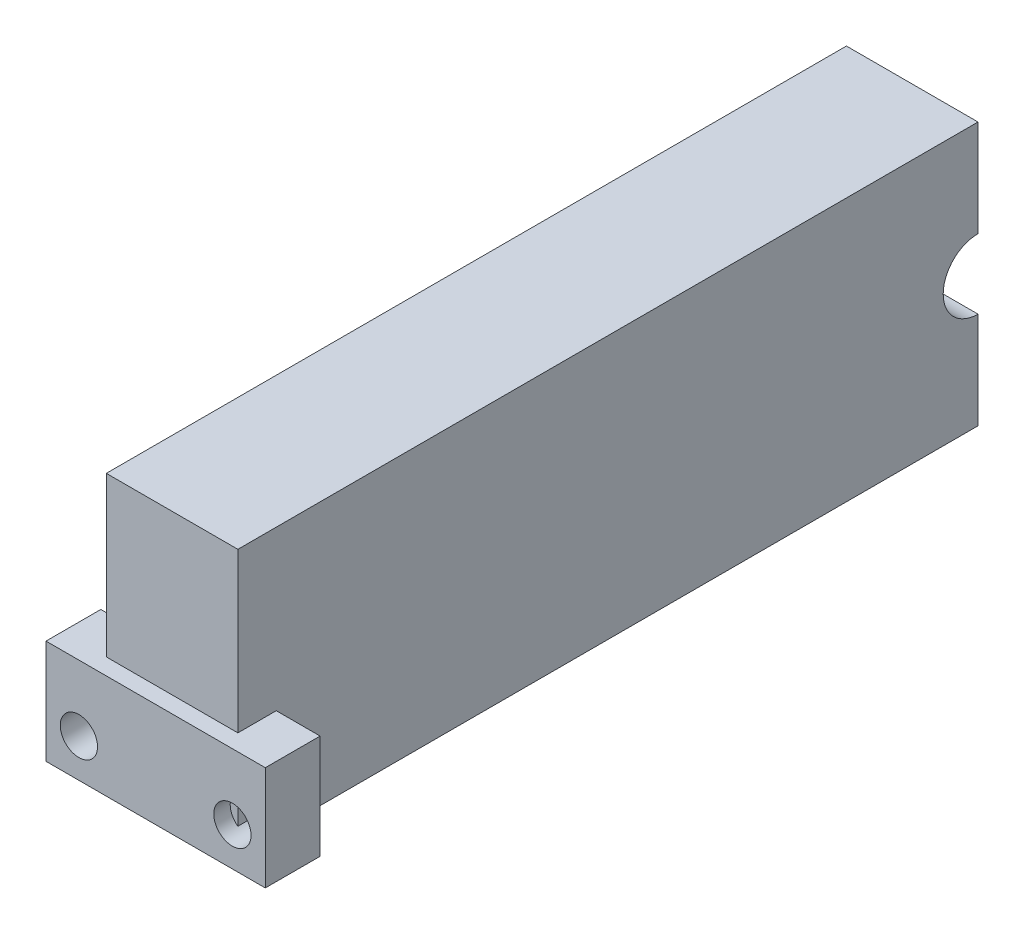
ISO-10303-21;
HEADER;
FILE_DESCRIPTION(('STEP AP214'),'2;1');
FILE_NAME('part.step','',(''),(''),'','','');
FILE_SCHEMA(('AUTOMOTIVE_DESIGN { 1 0 10303 214 1 1 1 1 }'));
ENDSEC;
DATA;
#1=APPLICATION_CONTEXT('core data for automotive mechanical design processes');
#2=APPLICATION_PROTOCOL_DEFINITION('international standard','automotive_design',2000,#1);
#3=PRODUCT_CONTEXT('',#1,'mechanical');
#4=PRODUCT('Part','Part','',(#3));
#5=PRODUCT_RELATED_PRODUCT_CATEGORY('part','',(#4));
#6=PRODUCT_DEFINITION_FORMATION('','',#4);
#7=PRODUCT_DEFINITION_CONTEXT('part definition',#1,'design');
#8=PRODUCT_DEFINITION('design','',#6,#7);
#9=PRODUCT_DEFINITION_SHAPE('','',#8);
#10=(LENGTH_UNIT() NAMED_UNIT(*) SI_UNIT(.MILLI.,.METRE.));
#11=(NAMED_UNIT(*) PLANE_ANGLE_UNIT() SI_UNIT($,.RADIAN.));
#12=(NAMED_UNIT(*) SI_UNIT($,.STERADIAN.) SOLID_ANGLE_UNIT());
#13=UNCERTAINTY_MEASURE_WITH_UNIT(LENGTH_MEASURE(1.E-05),#10,'distance_accuracy_value','');
#14=(GEOMETRIC_REPRESENTATION_CONTEXT(3) GLOBAL_UNCERTAINTY_ASSIGNED_CONTEXT((#13)) GLOBAL_UNIT_ASSIGNED_CONTEXT((#10,
#11,#12)) REPRESENTATION_CONTEXT('',''));
#15=CARTESIAN_POINT('',(0.,0.,0.));
#16=DIRECTION('',(0.,0.,1.));
#17=DIRECTION('',(1.,0.,0.));
#18=AXIS2_PLACEMENT_3D('',#15,#16,#17);
#19=CARTESIAN_POINT('',(0.,0.,-69.));
#20=DIRECTION('',(0.,0.,-1.));
#21=DIRECTION('',(-1.,0.,0.));
#22=AXIS2_PLACEMENT_3D('',#19,#20,#21);
#23=PLANE('',#22);
#24=DIRECTION('',(1.,0.,0.));
#25=VECTOR('',#24,1.);
#26=CARTESIAN_POINT('',(-30.,39.675,-69.));
#27=LINE('',#26,#25);
#28=CARTESIAN_POINT('',(-26.,39.675,-69.));
#29=VERTEX_POINT('',#28);
#30=CARTESIAN_POINT('',(-14.,39.675,-69.));
#31=VERTEX_POINT('',#30);
#32=EDGE_CURVE('E11',#29,#31,#27,.T.);
#33=ORIENTED_EDGE('',*,*,#32,.F.);
#34=DIRECTION('',(0.,-1.,0.));
#35=VECTOR('',#34,1.);
#36=CARTESIAN_POINT('',(-26.,24.5,-69.));
#37=LINE('',#36,#35);
#38=CARTESIAN_POINT('',(-26.,48.5,-69.));
#39=VERTEX_POINT('',#38);
#40=EDGE_CURVE('E163',#39,#29,#37,.T.);
#41=ORIENTED_EDGE('',*,*,#40,.F.);
#42=DIRECTION('',(-1.,0.,0.));
#43=VECTOR('',#42,1.);
#44=CARTESIAN_POINT('',(-26.,48.5,-69.));
#45=LINE('',#44,#43);
#46=CARTESIAN_POINT('',(-14.,48.5,-69.));
#47=VERTEX_POINT('',#46);
#48=EDGE_CURVE('E176',#47,#39,#45,.T.);
#49=ORIENTED_EDGE('',*,*,#48,.F.);
#50=DIRECTION('',(0.,1.,0.));
#51=VECTOR('',#50,1.);
#52=CARTESIAN_POINT('',(-14.,24.5,-69.));
#53=LINE('',#52,#51);
#54=EDGE_CURVE('E177',#31,#47,#53,.T.);
#55=ORIENTED_EDGE('',*,*,#54,.F.);
#56=EDGE_LOOP('',(#33,#41,#49,#55));
#57=FACE_BOUND('',#56,.T.);
#58=ADVANCED_FACE('F39',(#57),#23,.T.);
#59=CARTESIAN_POINT('',(0.,0.,-5.));
#60=DIRECTION('',(0.,0.,-1.));
#61=DIRECTION('',(-1.,0.,0.));
#62=AXIS2_PLACEMENT_3D('',#59,#60,#61);
#63=PLANE('',#62);
#64=DIRECTION('',(-1.,0.,0.));
#65=VECTOR('',#64,1.);
#66=CARTESIAN_POINT('',(-30.,34.,-5.));
#67=LINE('',#66,#65);
#68=CARTESIAN_POINT('',(-26.,34.,-5.));
#69=VERTEX_POINT('',#68);
#70=CARTESIAN_POINT('',(-30.,34.,-5.));
#71=VERTEX_POINT('',#70);
#72=EDGE_CURVE('E238',#69,#71,#67,.T.);
#73=ORIENTED_EDGE('',*,*,#72,.F.);
#74=DIRECTION('',(0.,-1.,0.));
#75=VECTOR('',#74,1.);
#76=CARTESIAN_POINT('',(-26.,0.,-5.));
#77=LINE('',#76,#75);
#78=CARTESIAN_POINT('',(-26.,29.3747727084868,-5.));
#79=VERTEX_POINT('',#78);
#80=EDGE_CURVE('E205',#69,#79,#77,.T.);
#81=ORIENTED_EDGE('',*,*,#80,.T.);
#82=CARTESIAN_POINT('',(-27.,28.,-5.));
#83=DIRECTION('',(0.,0.,1.));
#84=DIRECTION('',(1.,0.,0.));
#85=AXIS2_PLACEMENT_3D('',#82,#83,#84);
#86=CIRCLE('',#85,1.7);
#87=CARTESIAN_POINT('',(-26.,26.6252272915132,-5.));
#88=VERTEX_POINT('',#87);
#89=EDGE_CURVE('E211',#79,#88,#86,.T.);
#90=ORIENTED_EDGE('',*,*,#89,.T.);
#91=CARTESIAN_POINT('',(-26.,24.5,-5.));
#92=VERTEX_POINT('',#91);
#93=EDGE_CURVE('E206',#88,#92,#77,.T.);
#94=ORIENTED_EDGE('',*,*,#93,.T.);
#95=DIRECTION('',(1.,0.,0.));
#96=VECTOR('',#95,1.);
#97=CARTESIAN_POINT('',(-30.,24.5,-5.));
#98=LINE('',#97,#96);
#99=CARTESIAN_POINT('',(-30.,24.5,-5.));
#100=VERTEX_POINT('',#99);
#101=EDGE_CURVE('E233',#100,#92,#98,.T.);
#102=ORIENTED_EDGE('',*,*,#101,.F.);
#103=DIRECTION('',(0.,-1.,0.));
#104=VECTOR('',#103,1.);
#105=CARTESIAN_POINT('',(-30.,24.5,-5.));
#106=LINE('',#105,#104);
#107=EDGE_CURVE('E217',#71,#100,#106,.T.);
#108=ORIENTED_EDGE('',*,*,#107,.F.);
#109=EDGE_LOOP('',(#73,#81,#90,#94,#102,#108));
#110=FACE_BOUND('',#109,.T.);
#111=ADVANCED_FACE('F274',(#110),#63,.T.);
#112=CARTESIAN_POINT('',(-14.,24.5,-5.));
#113=VERTEX_POINT('',#112);
#114=CARTESIAN_POINT('',(-10.,24.5,-5.));
#115=VERTEX_POINT('',#114);
#116=EDGE_CURVE('E231',#113,#115,#98,.T.);
#117=ORIENTED_EDGE('',*,*,#116,.F.);
#118=DIRECTION('',(0.,1.,0.));
#119=VECTOR('',#118,1.);
#120=CARTESIAN_POINT('',(-14.,0.,-5.));
#121=LINE('',#120,#119);
#122=CARTESIAN_POINT('',(-14.,26.6252272915132,-5.));
#123=VERTEX_POINT('',#122);
#124=EDGE_CURVE('E198',#113,#123,#121,.T.);
#125=ORIENTED_EDGE('',*,*,#124,.T.);
#126=CARTESIAN_POINT('',(-13.,28.,-5.));
#127=DIRECTION('',(0.,0.,1.));
#128=DIRECTION('',(1.,0.,0.));
#129=AXIS2_PLACEMENT_3D('',#126,#127,#128);
#130=CIRCLE('',#129,1.7);
#131=CARTESIAN_POINT('',(-14.,29.3747727084868,-5.));
#132=VERTEX_POINT('',#131);
#133=EDGE_CURVE('E215',#123,#132,#130,.T.);
#134=ORIENTED_EDGE('',*,*,#133,.T.);
#135=CARTESIAN_POINT('',(-14.,34.,-5.));
#136=VERTEX_POINT('',#135);
#137=EDGE_CURVE('E200',#132,#136,#121,.T.);
#138=ORIENTED_EDGE('',*,*,#137,.T.);
#139=CARTESIAN_POINT('',(-10.,34.,-5.));
#140=VERTEX_POINT('',#139);
#141=EDGE_CURVE('E223',#140,#136,#67,.T.);
#142=ORIENTED_EDGE('',*,*,#141,.F.);
#143=DIRECTION('',(0.,1.,0.));
#144=VECTOR('',#143,1.);
#145=CARTESIAN_POINT('',(-10.,24.5,-5.));
#146=LINE('',#145,#144);
#147=EDGE_CURVE('E236',#115,#140,#146,.T.);
#148=ORIENTED_EDGE('',*,*,#147,.F.);
#149=EDGE_LOOP('',(#117,#125,#134,#138,#142,#148));
#150=FACE_BOUND('',#149,.T.);
#151=ADVANCED_FACE('F317',(#150),#63,.T.);
#152=CARTESIAN_POINT('',(-30.,34.,0.));
#153=DIRECTION('',(0.,-1.,0.));
#154=DIRECTION('',(0.,0.,-1.));
#155=AXIS2_PLACEMENT_3D('',#152,#153,#154);
#156=PLANE('',#155);
#157=DIRECTION('',(0.,0.,1.));
#158=VECTOR('',#157,1.);
#159=CARTESIAN_POINT('',(-26.,34.,0.));
#160=LINE('',#159,#158);
#161=CARTESIAN_POINT('',(-26.,34.,-1.5));
#162=VERTEX_POINT('',#161);
#163=EDGE_CURVE('E202',#69,#162,#160,.T.);
#164=ORIENTED_EDGE('',*,*,#163,.F.);
#165=ORIENTED_EDGE('',*,*,#72,.T.);
#166=DIRECTION('',(0.,0.,-1.));
#167=VECTOR('',#166,1.);
#168=CARTESIAN_POINT('',(-30.,34.,0.));
#169=LINE('',#168,#167);
#170=CARTESIAN_POINT('',(-30.,34.,0.));
#171=VERTEX_POINT('',#170);
#172=EDGE_CURVE('E232',#171,#71,#169,.T.);
#173=ORIENTED_EDGE('',*,*,#172,.F.);
#174=DIRECTION('',(-1.,0.,0.));
#175=VECTOR('',#174,1.);
#176=CARTESIAN_POINT('',(-30.,34.,0.));
#177=LINE('',#176,#175);
#178=CARTESIAN_POINT('',(-10.,34.,0.));
#179=VERTEX_POINT('',#178);
#180=EDGE_CURVE('E226',#179,#171,#177,.T.);
#181=ORIENTED_EDGE('',*,*,#180,.F.);
#182=DIRECTION('',(0.,0.,-1.));
#183=VECTOR('',#182,1.);
#184=CARTESIAN_POINT('',(-10.,34.,0.));
#185=LINE('',#184,#183);
#186=EDGE_CURVE('E243',#179,#140,#185,.T.);
#187=ORIENTED_EDGE('',*,*,#186,.T.);
#188=ORIENTED_EDGE('',*,*,#141,.T.);
#189=DIRECTION('',(0.,0.,-1.));
#190=VECTOR('',#189,1.);
#191=CARTESIAN_POINT('',(-14.,34.,0.));
#192=LINE('',#191,#190);
#193=CARTESIAN_POINT('',(-14.,34.,-1.5));
#194=VERTEX_POINT('',#193);
#195=EDGE_CURVE('E199',#194,#136,#192,.T.);
#196=ORIENTED_EDGE('',*,*,#195,.F.);
#197=DIRECTION('',(1.,0.,0.));
#198=VECTOR('',#197,1.);
#199=CARTESIAN_POINT('',(-30.,34.,-1.5));
#200=LINE('',#199,#198);
#201=EDGE_CURVE('E191',#162,#194,#200,.T.);
#202=ORIENTED_EDGE('',*,*,#201,.F.);
#203=EDGE_LOOP('',(#164,#165,#173,#181,#187,#188,#196,#202));
#204=FACE_BOUND('',#203,.T.);
#205=ADVANCED_FACE('F285',(#204),#156,.F.);
#206=CARTESIAN_POINT('',(-27.,28.,0.));
#207=DIRECTION('',(0.,0.,-1.));
#208=DIRECTION('',(-1.,0.,0.));
#209=AXIS2_PLACEMENT_3D('',#206,#207,#208);
#210=CYLINDRICAL_SURFACE('',#209,1.7);
#211=CARTESIAN_POINT('',(-27.,28.,0.));
#212=DIRECTION('',(0.,0.,1.));
#213=DIRECTION('',(1.,0.,0.));
#214=AXIS2_PLACEMENT_3D('',#211,#212,#213);
#215=CIRCLE('',#214,1.7);
#216=CARTESIAN_POINT('',(-25.3,28.,0.));
#217=VERTEX_POINT('',#216);
#218=EDGE_CURVE('E214',#217,#217,#215,.T.);
#219=ORIENTED_EDGE('',*,*,#218,.T.);
#220=EDGE_LOOP('',(#219));
#221=FACE_BOUND('',#220,.T.);
#222=CARTESIAN_POINT('',(-27.,28.,-1.5));
#223=DIRECTION('',(0.,0.,-1.));
#224=DIRECTION('',(-1.,0.,0.));
#225=AXIS2_PLACEMENT_3D('',#222,#223,#224);
#226=CIRCLE('',#225,1.7);
#227=CARTESIAN_POINT('',(-26.,29.3747727084868,-1.5));
#228=VERTEX_POINT('',#227);
#229=CARTESIAN_POINT('',(-26.,26.6252272915132,-1.5));
#230=VERTEX_POINT('',#229);
#231=EDGE_CURVE('E192',#228,#230,#226,.T.);
#232=ORIENTED_EDGE('',*,*,#231,.T.);
#233=DIRECTION('',(0.,0.,-1.));
#234=VECTOR('',#233,1.);
#235=CARTESIAN_POINT('',(-26.,26.6252272915132,0.));
#236=LINE('',#235,#234);
#237=EDGE_CURVE('E156',#230,#88,#236,.T.);
#238=ORIENTED_EDGE('',*,*,#237,.T.);
#239=ORIENTED_EDGE('',*,*,#89,.F.);
#240=DIRECTION('',(0.,0.,-1.));
#241=VECTOR('',#240,1.);
#242=CARTESIAN_POINT('',(-26.,29.3747727084868,0.));
#243=LINE('',#242,#241);
#244=EDGE_CURVE('E263',#79,#228,#243,.F.);
#245=ORIENTED_EDGE('',*,*,#244,.T.);
#246=EDGE_LOOP('',(#232,#238,#239,#245));
#247=FACE_BOUND('',#246,.T.);
#248=ADVANCED_FACE('F267',(#221,#247),#210,.F.);
#249=CARTESIAN_POINT('',(-13.,28.,0.));
#250=DIRECTION('',(0.,0.,-1.));
#251=DIRECTION('',(-1.,0.,0.));
#252=AXIS2_PLACEMENT_3D('',#249,#250,#251);
#253=CYLINDRICAL_SURFACE('',#252,1.7);
#254=CARTESIAN_POINT('',(-13.,28.,0.));
#255=DIRECTION('',(0.,0.,1.));
#256=DIRECTION('',(1.,0.,0.));
#257=AXIS2_PLACEMENT_3D('',#254,#255,#256);
#258=CIRCLE('',#257,1.7);
#259=CARTESIAN_POINT('',(-11.3,28.,0.));
#260=VERTEX_POINT('',#259);
#261=EDGE_CURVE('E208',#260,#260,#258,.T.);
#262=ORIENTED_EDGE('',*,*,#261,.T.);
#263=EDGE_LOOP('',(#262));
#264=FACE_BOUND('',#263,.T.);
#265=CARTESIAN_POINT('',(-13.,28.,-1.5));
#266=DIRECTION('',(0.,0.,-1.));
#267=DIRECTION('',(-1.,0.,0.));
#268=AXIS2_PLACEMENT_3D('',#265,#266,#267);
#269=CIRCLE('',#268,1.7);
#270=CARTESIAN_POINT('',(-14.,26.6252272915132,-1.5));
#271=VERTEX_POINT('',#270);
#272=CARTESIAN_POINT('',(-14.,29.3747727084868,-1.5));
#273=VERTEX_POINT('',#272);
#274=EDGE_CURVE('E255',#271,#273,#269,.T.);
#275=ORIENTED_EDGE('',*,*,#274,.T.);
#276=DIRECTION('',(0.,0.,-1.));
#277=VECTOR('',#276,1.);
#278=CARTESIAN_POINT('',(-14.,29.3747727084868,0.));
#279=LINE('',#278,#277);
#280=EDGE_CURVE('E257',#273,#132,#279,.T.);
#281=ORIENTED_EDGE('',*,*,#280,.T.);
#282=ORIENTED_EDGE('',*,*,#133,.F.);
#283=DIRECTION('',(0.,0.,-1.));
#284=VECTOR('',#283,1.);
#285=CARTESIAN_POINT('',(-14.,26.6252272915132,0.));
#286=LINE('',#285,#284);
#287=EDGE_CURVE('E260',#123,#271,#286,.F.);
#288=ORIENTED_EDGE('',*,*,#287,.T.);
#289=EDGE_LOOP('',(#275,#281,#282,#288));
#290=FACE_BOUND('',#289,.T.);
#291=ADVANCED_FACE('F416',(#264,#290),#253,.F.);
#292=CARTESIAN_POINT('',(0.,0.,0.));
#293=DIRECTION('',(0.,0.,-1.));
#294=DIRECTION('',(-1.,0.,0.));
#295=AXIS2_PLACEMENT_3D('',#292,#293,#294);
#296=PLANE('',#295);
#297=DIRECTION('',(0.,-1.,0.));
#298=VECTOR('',#297,1.);
#299=CARTESIAN_POINT('',(-30.,24.5,0.));
#300=LINE('',#299,#298);
#301=CARTESIAN_POINT('',(-30.,24.5,0.));
#302=VERTEX_POINT('',#301);
#303=EDGE_CURVE('E222',#171,#302,#300,.T.);
#304=ORIENTED_EDGE('',*,*,#303,.T.);
#305=DIRECTION('',(1.,0.,0.));
#306=VECTOR('',#305,1.);
#307=CARTESIAN_POINT('',(-30.,24.5,0.));
#308=LINE('',#307,#306);
#309=CARTESIAN_POINT('',(-10.,24.5,0.));
#310=VERTEX_POINT('',#309);
#311=EDGE_CURVE('E221',#302,#310,#308,.T.);
#312=ORIENTED_EDGE('',*,*,#311,.T.);
#313=DIRECTION('',(0.,1.,0.));
#314=VECTOR('',#313,1.);
#315=CARTESIAN_POINT('',(-10.,24.5,0.));
#316=LINE('',#315,#314);
#317=EDGE_CURVE('E230',#310,#179,#316,.T.);
#318=ORIENTED_EDGE('',*,*,#317,.T.);
#319=ORIENTED_EDGE('',*,*,#180,.T.);
#320=EDGE_LOOP('',(#304,#312,#318,#319));
#321=FACE_BOUND('',#320,.T.);
#322=ORIENTED_EDGE('',*,*,#218,.F.);
#323=EDGE_LOOP('',(#322));
#324=FACE_BOUND('',#323,.T.);
#325=ORIENTED_EDGE('',*,*,#261,.F.);
#326=EDGE_LOOP('',(#325));
#327=FACE_BOUND('',#326,.T.);
#328=ADVANCED_FACE('F422',(#321,#324,#327),#296,.F.);
#329=CARTESIAN_POINT('',(-30.,24.5,0.));
#330=DIRECTION('',(1.,0.,0.));
#331=DIRECTION('',(0.,0.,-1.));
#332=AXIS2_PLACEMENT_3D('',#329,#330,#331);
#333=PLANE('',#332);
#334=ORIENTED_EDGE('',*,*,#107,.T.);
#335=DIRECTION('',(0.,0.,-1.));
#336=VECTOR('',#335,1.);
#337=CARTESIAN_POINT('',(-30.,24.5,0.));
#338=LINE('',#337,#336);
#339=EDGE_CURVE('E253',#302,#100,#338,.T.);
#340=ORIENTED_EDGE('',*,*,#339,.F.);
#341=ORIENTED_EDGE('',*,*,#303,.F.);
#342=ORIENTED_EDGE('',*,*,#172,.T.);
#343=EDGE_LOOP('',(#334,#340,#341,#342));
#344=FACE_BOUND('',#343,.T.);
#345=ADVANCED_FACE('F41',(#344),#333,.F.);
#346=CARTESIAN_POINT('',(-30.,24.5,0.));
#347=DIRECTION('',(0.,1.,0.));
#348=DIRECTION('',(0.,0.,1.));
#349=AXIS2_PLACEMENT_3D('',#346,#347,#348);
#350=PLANE('',#349);
#351=ORIENTED_EDGE('',*,*,#101,.T.);
#352=DIRECTION('',(0.,0.,-1.));
#353=VECTOR('',#352,1.);
#354=CARTESIAN_POINT('',(-26.,24.5,-1.5));
#355=LINE('',#354,#353);
#356=CARTESIAN_POINT('',(-26.,24.5,-69.));
#357=VERTEX_POINT('',#356);
#358=EDGE_CURVE('E186',#92,#357,#355,.T.);
#359=ORIENTED_EDGE('',*,*,#358,.T.);
#360=DIRECTION('',(1.,0.,0.));
#361=VECTOR('',#360,1.);
#362=CARTESIAN_POINT('',(-26.,24.5,-69.));
#363=LINE('',#362,#361);
#364=CARTESIAN_POINT('',(-14.,24.5,-69.));
#365=VERTEX_POINT('',#364);
#366=EDGE_CURVE('E166',#357,#365,#363,.T.);
#367=ORIENTED_EDGE('',*,*,#366,.T.);
#368=DIRECTION('',(0.,0.,-1.));
#369=VECTOR('',#368,1.);
#370=CARTESIAN_POINT('',(-14.,24.5,-1.5));
#371=LINE('',#370,#369);
#372=EDGE_CURVE('E190',#113,#365,#371,.T.);
#373=ORIENTED_EDGE('',*,*,#372,.F.);
#374=ORIENTED_EDGE('',*,*,#116,.T.);
#375=DIRECTION('',(0.,0.,-1.));
#376=VECTOR('',#375,1.);
#377=CARTESIAN_POINT('',(-10.,24.5,0.));
#378=LINE('',#377,#376);
#379=EDGE_CURVE('E249',#310,#115,#378,.T.);
#380=ORIENTED_EDGE('',*,*,#379,.F.);
#381=ORIENTED_EDGE('',*,*,#311,.F.);
#382=ORIENTED_EDGE('',*,*,#339,.T.);
#383=EDGE_LOOP('',(#351,#359,#367,#373,#374,#380,#381,#382));
#384=FACE_BOUND('',#383,.T.);
#385=ADVANCED_FACE('F385',(#384),#350,.F.);
#386=CARTESIAN_POINT('',(-10.,24.5,0.));
#387=DIRECTION('',(-1.,0.,0.));
#388=DIRECTION('',(0.,0.,1.));
#389=AXIS2_PLACEMENT_3D('',#386,#387,#388);
#390=PLANE('',#389);
#391=ORIENTED_EDGE('',*,*,#147,.T.);
#392=ORIENTED_EDGE('',*,*,#186,.F.);
#393=ORIENTED_EDGE('',*,*,#317,.F.);
#394=ORIENTED_EDGE('',*,*,#379,.T.);
#395=EDGE_LOOP('',(#391,#392,#393,#394));
#396=FACE_BOUND('',#395,.T.);
#397=ADVANCED_FACE('F380',(#396),#390,.F.);
#398=CARTESIAN_POINT('',(-26.,24.5,-1.5));
#399=DIRECTION('',(1.,0.,0.));
#400=DIRECTION('',(0.,0.,-1.));
#401=AXIS2_PLACEMENT_3D('',#398,#399,#400);
#402=PLANE('',#401);
#403=ORIENTED_EDGE('',*,*,#40,.T.);
#404=CARTESIAN_POINT('',(-26.,36.5,-69.));
#405=DIRECTION('',(1.,0.,0.));
#406=DIRECTION('',(0.,0.,-1.));
#407=AXIS2_PLACEMENT_3D('',#404,#405,#406);
#408=CIRCLE('',#407,3.175);
#409=CARTESIAN_POINT('',(-26.,33.325,-69.));
#410=VERTEX_POINT('',#409);
#411=EDGE_CURVE('E147',#29,#410,#408,.T.);
#412=ORIENTED_EDGE('',*,*,#411,.T.);
#413=EDGE_CURVE('E159',#410,#357,#37,.T.);
#414=ORIENTED_EDGE('',*,*,#413,.T.);
#415=ORIENTED_EDGE('',*,*,#358,.F.);
#416=ORIENTED_EDGE('',*,*,#93,.F.);
#417=ORIENTED_EDGE('',*,*,#237,.F.);
#418=DIRECTION('',(0.,-1.,0.));
#419=VECTOR('',#418,1.);
#420=CARTESIAN_POINT('',(-26.,24.5,-1.5));
#421=LINE('',#420,#419);
#422=EDGE_CURVE('E182',#228,#230,#421,.T.);
#423=ORIENTED_EDGE('',*,*,#422,.F.);
#424=ORIENTED_EDGE('',*,*,#244,.F.);
#425=ORIENTED_EDGE('',*,*,#80,.F.);
#426=ORIENTED_EDGE('',*,*,#163,.T.);
#427=CARTESIAN_POINT('',(-26.,48.5,-1.5));
#428=VERTEX_POINT('',#427);
#429=EDGE_CURVE('E288',#428,#162,#421,.T.);
#430=ORIENTED_EDGE('',*,*,#429,.F.);
#431=DIRECTION('',(0.,0.,-1.));
#432=VECTOR('',#431,1.);
#433=CARTESIAN_POINT('',(-26.,48.5,-1.5));
#434=LINE('',#433,#432);
#435=EDGE_CURVE('E185',#428,#39,#434,.T.);
#436=ORIENTED_EDGE('',*,*,#435,.T.);
#437=EDGE_LOOP('',(#403,#412,#414,#415,#416,#417,#423,#424,#425,#426,#430,#436));
#438=FACE_BOUND('',#437,.T.);
#439=ADVANCED_FACE('F157',(#438),#402,.F.);
#440=CARTESIAN_POINT('',(-14.,24.5,-1.5));
#441=DIRECTION('',(-1.,0.,0.));
#442=DIRECTION('',(0.,0.,1.));
#443=AXIS2_PLACEMENT_3D('',#440,#441,#442);
#444=PLANE('',#443);
#445=CARTESIAN_POINT('',(-14.,33.325,-69.));
#446=VERTEX_POINT('',#445);
#447=EDGE_CURVE('E180',#365,#446,#53,.T.);
#448=ORIENTED_EDGE('',*,*,#447,.T.);
#449=CARTESIAN_POINT('',(-14.,36.5,-69.));
#450=DIRECTION('',(-1.,0.,0.));
#451=DIRECTION('',(0.,0.,1.));
#452=AXIS2_PLACEMENT_3D('',#449,#450,#451);
#453=CIRCLE('',#452,3.175);
#454=EDGE_CURVE('E52',#446,#31,#453,.T.);
#455=ORIENTED_EDGE('',*,*,#454,.T.);
#456=ORIENTED_EDGE('',*,*,#54,.T.);
#457=DIRECTION('',(0.,0.,-1.));
#458=VECTOR('',#457,1.);
#459=CARTESIAN_POINT('',(-14.,48.5,-1.5));
#460=LINE('',#459,#458);
#461=CARTESIAN_POINT('',(-14.,48.5,-1.5));
#462=VERTEX_POINT('',#461);
#463=EDGE_CURVE('E184',#462,#47,#460,.T.);
#464=ORIENTED_EDGE('',*,*,#463,.F.);
#465=DIRECTION('',(0.,1.,0.));
#466=VECTOR('',#465,1.);
#467=CARTESIAN_POINT('',(-14.,24.5,-1.5));
#468=LINE('',#467,#466);
#469=EDGE_CURVE('E289',#194,#462,#468,.T.);
#470=ORIENTED_EDGE('',*,*,#469,.F.);
#471=ORIENTED_EDGE('',*,*,#195,.T.);
#472=ORIENTED_EDGE('',*,*,#137,.F.);
#473=ORIENTED_EDGE('',*,*,#280,.F.);
#474=EDGE_CURVE('E58',#271,#273,#468,.T.);
#475=ORIENTED_EDGE('',*,*,#474,.F.);
#476=ORIENTED_EDGE('',*,*,#287,.F.);
#477=ORIENTED_EDGE('',*,*,#124,.F.);
#478=ORIENTED_EDGE('',*,*,#372,.T.);
#479=EDGE_LOOP('',(#448,#455,#456,#464,#470,#471,#472,#473,#475,#476,#477,#478));
#480=FACE_BOUND('',#479,.T.);
#481=ADVANCED_FACE('F295',(#480),#444,.F.);
#482=CARTESIAN_POINT('',(0.,0.,-1.5));
#483=DIRECTION('',(0.,0.,-1.));
#484=DIRECTION('',(-1.,0.,0.));
#485=AXIS2_PLACEMENT_3D('',#482,#483,#484);
#486=PLANE('',#485);
#487=ORIENTED_EDGE('',*,*,#231,.F.);
#488=ORIENTED_EDGE('',*,*,#422,.T.);
#489=EDGE_LOOP('',(#487,#488));
#490=FACE_BOUND('',#489,.T.);
#491=ADVANCED_FACE('F313',(#490),#486,.F.);
#492=ORIENTED_EDGE('',*,*,#274,.F.);
#493=ORIENTED_EDGE('',*,*,#474,.T.);
#494=EDGE_LOOP('',(#492,#493));
#495=FACE_BOUND('',#494,.T.);
#496=ADVANCED_FACE('F301',(#495),#486,.F.);
#497=CARTESIAN_POINT('',(-26.,48.5,-1.5));
#498=DIRECTION('',(0.,-1.,0.));
#499=DIRECTION('',(0.,0.,-1.));
#500=AXIS2_PLACEMENT_3D('',#497,#498,#499);
#501=PLANE('',#500);
#502=ORIENTED_EDGE('',*,*,#48,.T.);
#503=ORIENTED_EDGE('',*,*,#435,.F.);
#504=DIRECTION('',(-1.,0.,0.));
#505=VECTOR('',#504,1.);
#506=CARTESIAN_POINT('',(-26.,48.5,-1.5));
#507=LINE('',#506,#505);
#508=EDGE_CURVE('E174',#462,#428,#507,.T.);
#509=ORIENTED_EDGE('',*,*,#508,.F.);
#510=ORIENTED_EDGE('',*,*,#463,.T.);
#511=EDGE_LOOP('',(#502,#503,#509,#510));
#512=FACE_BOUND('',#511,.T.);
#513=ADVANCED_FACE('F305',(#512),#501,.F.);
#514=ORIENTED_EDGE('',*,*,#429,.T.);
#515=ORIENTED_EDGE('',*,*,#201,.T.);
#516=ORIENTED_EDGE('',*,*,#469,.T.);
#517=ORIENTED_EDGE('',*,*,#508,.T.);
#518=EDGE_LOOP('',(#514,#515,#516,#517));
#519=FACE_BOUND('',#518,.T.);
#520=ADVANCED_FACE('F290',(#519),#486,.F.);
#521=DIRECTION('',(1.,0.,0.));
#522=VECTOR('',#521,1.);
#523=CARTESIAN_POINT('',(-30.,33.325,-69.));
#524=LINE('',#523,#522);
#525=EDGE_CURVE('E50',#446,#410,#524,.F.);
#526=ORIENTED_EDGE('',*,*,#525,.F.);
#527=ORIENTED_EDGE('',*,*,#447,.F.);
#528=ORIENTED_EDGE('',*,*,#366,.F.);
#529=ORIENTED_EDGE('',*,*,#413,.F.);
#530=EDGE_LOOP('',(#526,#527,#528,#529));
#531=FACE_BOUND('',#530,.T.);
#532=ADVANCED_FACE('F170',(#531),#23,.T.);
#533=CARTESIAN_POINT('',(-30.,36.5,-69.));
#534=DIRECTION('',(1.,0.,0.));
#535=DIRECTION('',(0.,0.,-1.));
#536=AXIS2_PLACEMENT_3D('',#533,#534,#535);
#537=CYLINDRICAL_SURFACE('',#536,3.175);
#538=ORIENTED_EDGE('',*,*,#32,.T.);
#539=ORIENTED_EDGE('',*,*,#454,.F.);
#540=ORIENTED_EDGE('',*,*,#525,.T.);
#541=ORIENTED_EDGE('',*,*,#411,.F.);
#542=EDGE_LOOP('',(#538,#539,#540,#541));
#543=FACE_BOUND('',#542,.T.);
#544=ADVANCED_FACE('F149',(#543),#537,.F.);
#545=CLOSED_SHELL('',(#58,#111,#151,#205,#248,#291,#328,#345,#385,#397,#439,#481,#491,#496,#513,
#520,#532,#544));
#546=MANIFOLD_SOLID_BREP('B2',#545);
#547=ADVANCED_BREP_SHAPE_REPRESENTATION('',(#18,#546),#14);
#548=SHAPE_DEFINITION_REPRESENTATION(#9,#547);
ENDSEC;
END-ISO-10303-21;
